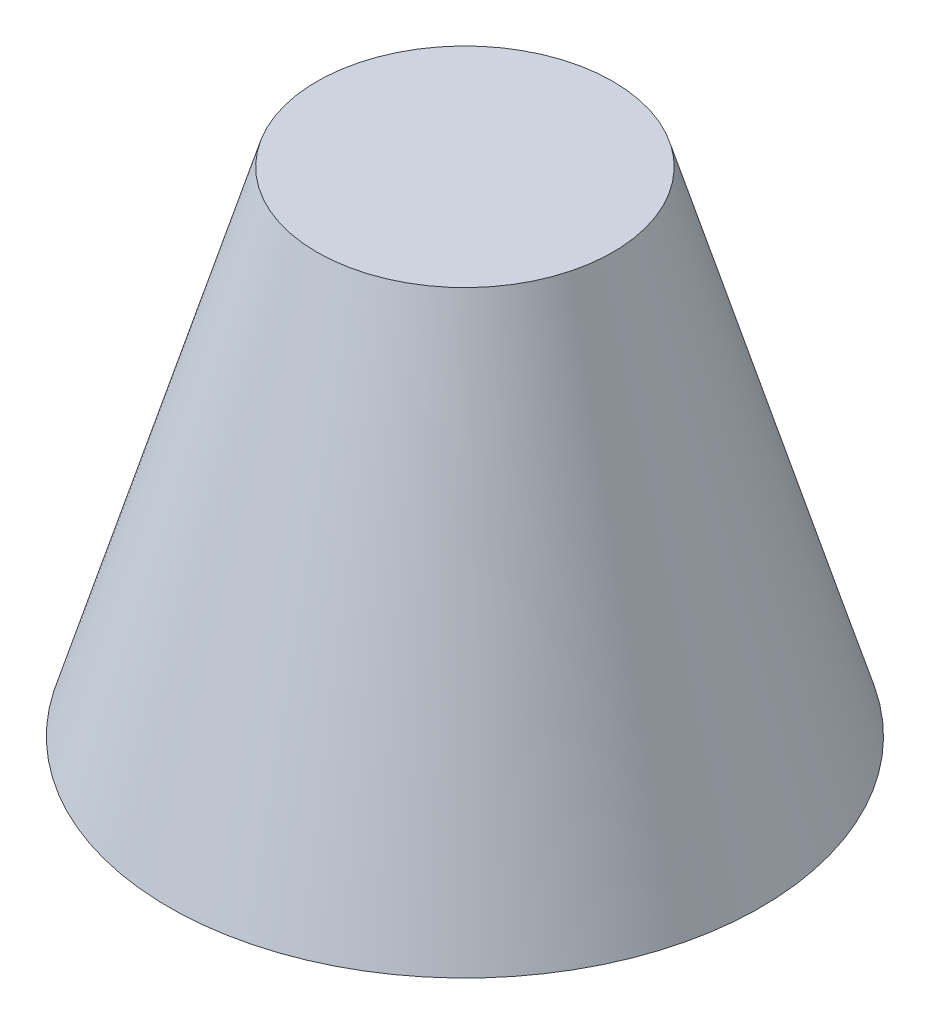
ISO-10303-21;
HEADER;
FILE_DESCRIPTION(('STEP AP214'),'2;1');
FILE_NAME('part.step','',(''),(''),'','','');
FILE_SCHEMA(('AUTOMOTIVE_DESIGN { 1 0 10303 214 1 1 1 1 }'));
ENDSEC;
DATA;
#1=APPLICATION_CONTEXT('core data for automotive mechanical design processes');
#2=APPLICATION_PROTOCOL_DEFINITION('international standard','automotive_design',2000,#1);
#3=PRODUCT_CONTEXT('',#1,'mechanical');
#4=PRODUCT('Part','Part','',(#3));
#5=PRODUCT_RELATED_PRODUCT_CATEGORY('part','',(#4));
#6=PRODUCT_DEFINITION_FORMATION('','',#4);
#7=PRODUCT_DEFINITION_CONTEXT('part definition',#1,'design');
#8=PRODUCT_DEFINITION('design','',#6,#7);
#9=PRODUCT_DEFINITION_SHAPE('','',#8);
#10=(LENGTH_UNIT() NAMED_UNIT(*) SI_UNIT(.MILLI.,.METRE.));
#11=(NAMED_UNIT(*) PLANE_ANGLE_UNIT() SI_UNIT($,.RADIAN.));
#12=(NAMED_UNIT(*) SI_UNIT($,.STERADIAN.) SOLID_ANGLE_UNIT());
#13=UNCERTAINTY_MEASURE_WITH_UNIT(LENGTH_MEASURE(1.E-05),#10,'distance_accuracy_value','');
#14=(GEOMETRIC_REPRESENTATION_CONTEXT(3) GLOBAL_UNCERTAINTY_ASSIGNED_CONTEXT((#13)) GLOBAL_UNIT_ASSIGNED_CONTEXT((#10,
#11,#12)) REPRESENTATION_CONTEXT('',''));
#15=CARTESIAN_POINT('',(0.,0.,0.));
#16=DIRECTION('',(0.,0.,1.));
#17=DIRECTION('',(1.,0.,0.));
#18=AXIS2_PLACEMENT_3D('',#15,#16,#17);
#19=CARTESIAN_POINT('',(-15.,0.,0.));
#20=DIRECTION('',(0.,1.,0.));
#21=DIRECTION('',(0.,0.,1.));
#22=AXIS2_PLACEMENT_3D('',#19,#20,#21);
#23=PLANE('',#22);
#24=CARTESIAN_POINT('',(0.,0.,0.));
#25=DIRECTION('',(0.,-1.,0.));
#26=DIRECTION('',(0.,0.,-1.));
#27=AXIS2_PLACEMENT_3D('',#24,#25,#26);
#28=CIRCLE('',#27,15.);
#29=CARTESIAN_POINT('',(0.,0.,-15.));
#30=VERTEX_POINT('',#29);
#31=EDGE_CURVE('E44',#30,#30,#28,.T.);
#32=ORIENTED_EDGE('',*,*,#31,.T.);
#33=EDGE_LOOP('',(#32));
#34=FACE_BOUND('',#33,.T.);
#35=ADVANCED_FACE('F37',(#34),#23,.F.);
#36=CARTESIAN_POINT('',(0.,25.,0.));
#37=DIRECTION('',(0.,-1.,0.));
#38=DIRECTION('',(0.,0.,-1.));
#39=AXIS2_PLACEMENT_3D('',#36,#37,#38);
#40=PLANE('',#39);
#41=CARTESIAN_POINT('',(0.,25.,0.));
#42=DIRECTION('',(0.,-1.,0.));
#43=DIRECTION('',(0.,0.,-1.));
#44=AXIS2_PLACEMENT_3D('',#41,#42,#43);
#45=CIRCLE('',#44,7.5);
#46=CARTESIAN_POINT('',(0.,25.,-7.5));
#47=VERTEX_POINT('',#46);
#48=EDGE_CURVE('E10',#47,#47,#45,.T.);
#49=ORIENTED_EDGE('',*,*,#48,.F.);
#50=EDGE_LOOP('',(#49));
#51=FACE_BOUND('',#50,.T.);
#52=ADVANCED_FACE('F54',(#51),#40,.F.);
#53=CARTESIAN_POINT('',(0.,25.,0.));
#54=DIRECTION('',(0.,-1.,0.));
#55=DIRECTION('',(0.,0.,-1.));
#56=AXIS2_PLACEMENT_3D('',#53,#54,#55);
#57=CONICAL_SURFACE('',#56,7.5,0.291456794477867);
#58=ORIENTED_EDGE('',*,*,#31,.F.);
#59=EDGE_LOOP('',(#58));
#60=FACE_BOUND('',#59,.T.);
#61=ORIENTED_EDGE('',*,*,#48,.T.);
#62=EDGE_LOOP('',(#61));
#63=FACE_BOUND('',#62,.T.);
#64=ADVANCED_FACE('F52',(#60,#63),#57,.T.);
#65=CLOSED_SHELL('',(#35,#52,#64));
#66=MANIFOLD_SOLID_BREP('B2',#65);
#67=ADVANCED_BREP_SHAPE_REPRESENTATION('',(#18,#66),#14);
#68=SHAPE_DEFINITION_REPRESENTATION(#9,#67);
ENDSEC;
END-ISO-10303-21;
